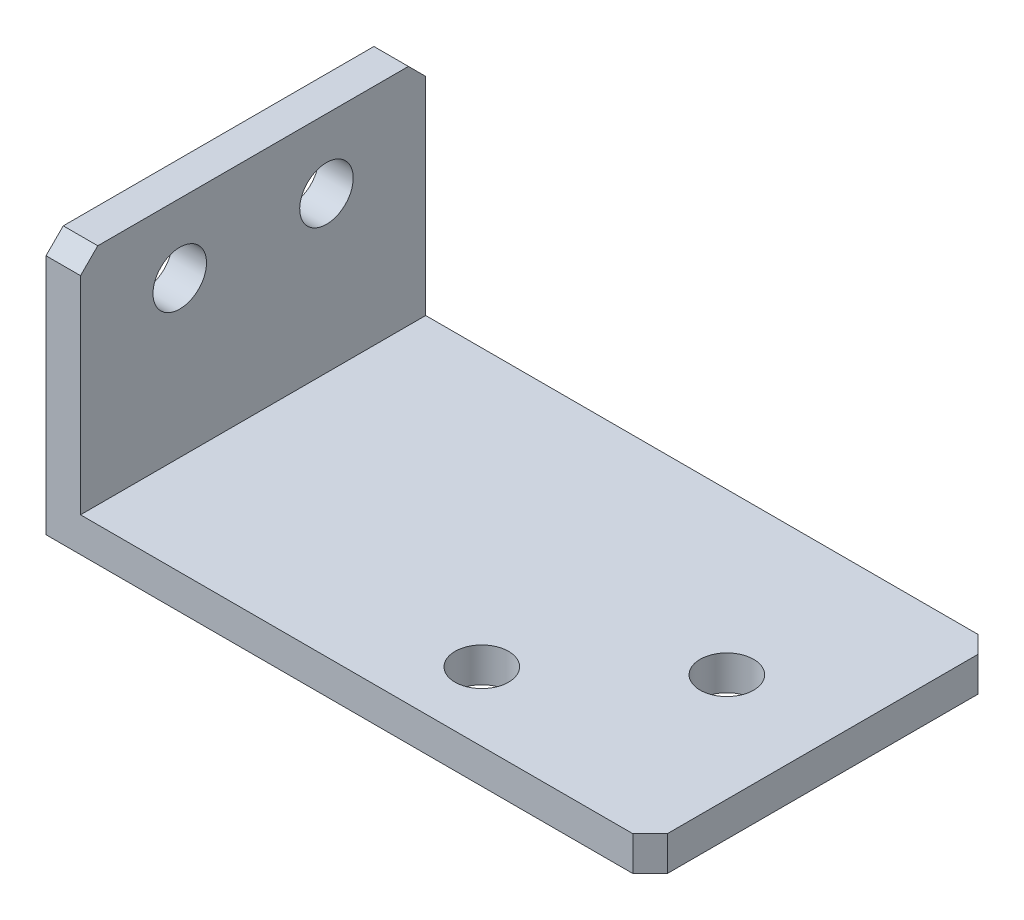
ISO-10303-21;
HEADER;
FILE_DESCRIPTION(('STEP AP214'),'2;1');
FILE_NAME('part.step','',(''),(''),'','','');
FILE_SCHEMA(('AUTOMOTIVE_DESIGN { 1 0 10303 214 1 1 1 1 }'));
ENDSEC;
DATA;
#1=APPLICATION_CONTEXT('core data for automotive mechanical design processes');
#2=APPLICATION_PROTOCOL_DEFINITION('international standard','automotive_design',2000,#1);
#3=PRODUCT_CONTEXT('',#1,'mechanical');
#4=PRODUCT('Part','Part','',(#3));
#5=PRODUCT_RELATED_PRODUCT_CATEGORY('part','',(#4));
#6=PRODUCT_DEFINITION_FORMATION('','',#4);
#7=PRODUCT_DEFINITION_CONTEXT('part definition',#1,'design');
#8=PRODUCT_DEFINITION('design','',#6,#7);
#9=PRODUCT_DEFINITION_SHAPE('','',#8);
#10=(LENGTH_UNIT() NAMED_UNIT(*) SI_UNIT(.MILLI.,.METRE.));
#11=(NAMED_UNIT(*) PLANE_ANGLE_UNIT() SI_UNIT($,.RADIAN.));
#12=(NAMED_UNIT(*) SI_UNIT($,.STERADIAN.) SOLID_ANGLE_UNIT());
#13=UNCERTAINTY_MEASURE_WITH_UNIT(LENGTH_MEASURE(1.E-05),#10,'distance_accuracy_value','');
#14=(GEOMETRIC_REPRESENTATION_CONTEXT(3) GLOBAL_UNCERTAINTY_ASSIGNED_CONTEXT((#13)) GLOBAL_UNIT_ASSIGNED_CONTEXT((#10,
#11,#12)) REPRESENTATION_CONTEXT('',''));
#15=CARTESIAN_POINT('',(0.,0.,0.));
#16=DIRECTION('',(0.,0.,1.));
#17=DIRECTION('',(1.,0.,0.));
#18=AXIS2_PLACEMENT_3D('',#15,#16,#17);
#19=CARTESIAN_POINT('',(0.,15.,20.));
#20=DIRECTION('',(1.,0.,0.));
#21=DIRECTION('',(0.,1.,0.));
#22=AXIS2_PLACEMENT_3D('',#19,#20,#21);
#23=PLANE('',#22);
#24=CARTESIAN_POINT('',(0.,11.,5.75));
#25=DIRECTION('',(-1.,0.,0.));
#26=DIRECTION('',(0.,-1.,0.));
#27=AXIS2_PLACEMENT_3D('',#24,#25,#26);
#28=CIRCLE('',#27,1.55);
#29=CARTESIAN_POINT('',(0.,9.45,5.75));
#30=VERTEX_POINT('',#29);
#31=EDGE_CURVE('E347',#30,#30,#28,.T.);
#32=ORIENTED_EDGE('',*,*,#31,.F.);
#33=EDGE_LOOP('',(#32));
#34=FACE_BOUND('',#33,.T.);
#35=CARTESIAN_POINT('',(0.,11.,14.25));
#36=DIRECTION('',(-1.,0.,0.));
#37=DIRECTION('',(0.,-1.,0.));
#38=AXIS2_PLACEMENT_3D('',#35,#36,#37);
#39=CIRCLE('',#38,1.55);
#40=CARTESIAN_POINT('',(0.,9.45,14.25));
#41=VERTEX_POINT('',#40);
#42=EDGE_CURVE('E350',#41,#41,#39,.T.);
#43=ORIENTED_EDGE('',*,*,#42,.F.);
#44=EDGE_LOOP('',(#43));
#45=FACE_BOUND('',#44,.T.);
#46=DIRECTION('',(0.,0.,-1.));
#47=VECTOR('',#46,1.);
#48=CARTESIAN_POINT('',(0.,15.,20.));
#49=LINE('',#48,#47);
#50=CARTESIAN_POINT('',(0.,15.,19.));
#51=VERTEX_POINT('',#50);
#52=CARTESIAN_POINT('',(0.,15.,1.00000000000001));
#53=VERTEX_POINT('',#52);
#54=EDGE_CURVE('E181',#51,#53,#49,.T.);
#55=ORIENTED_EDGE('',*,*,#54,.T.);
#56=DIRECTION('',(0.,0.707106781186548,0.707106781186548));
#57=VECTOR('',#56,1.);
#58=CARTESIAN_POINT('',(0.,15.,1.00000000000001));
#59=LINE('',#58,#57);
#60=CARTESIAN_POINT('',(0.,14.,0.));
#61=VERTEX_POINT('',#60);
#62=EDGE_CURVE('E166',#53,#61,#59,.F.);
#63=ORIENTED_EDGE('',*,*,#62,.T.);
#64=DIRECTION('',(0.,-1.,0.));
#65=VECTOR('',#64,1.);
#66=CARTESIAN_POINT('',(0.,15.,0.));
#67=LINE('',#66,#65);
#68=CARTESIAN_POINT('',(0.,0.,0.));
#69=VERTEX_POINT('',#68);
#70=EDGE_CURVE('E135',#61,#69,#67,.T.);
#71=ORIENTED_EDGE('',*,*,#70,.T.);
#72=DIRECTION('',(0.,0.,-1.));
#73=VECTOR('',#72,1.);
#74=CARTESIAN_POINT('',(0.,0.,20.));
#75=LINE('',#74,#73);
#76=CARTESIAN_POINT('',(0.,0.,20.));
#77=VERTEX_POINT('',#76);
#78=EDGE_CURVE('E127',#77,#69,#75,.T.);
#79=ORIENTED_EDGE('',*,*,#78,.F.);
#80=DIRECTION('',(0.,-1.,0.));
#81=VECTOR('',#80,1.);
#82=CARTESIAN_POINT('',(0.,15.,20.));
#83=LINE('',#82,#81);
#84=CARTESIAN_POINT('',(0.,14.,20.));
#85=VERTEX_POINT('',#84);
#86=EDGE_CURVE('E113',#85,#77,#83,.T.);
#87=ORIENTED_EDGE('',*,*,#86,.F.);
#88=DIRECTION('',(0.,0.707106781186548,-0.707106781186548));
#89=VECTOR('',#88,1.);
#90=CARTESIAN_POINT('',(0.,14.,20.));
#91=LINE('',#90,#89);
#92=EDGE_CURVE('E57',#85,#51,#91,.T.);
#93=ORIENTED_EDGE('',*,*,#92,.T.);
#94=EDGE_LOOP('',(#55,#63,#71,#79,#87,#93));
#95=FACE_BOUND('',#94,.T.);
#96=ADVANCED_FACE('F34',(#34,#45,#95),#23,.F.);
#97=CARTESIAN_POINT('',(0.,0.,20.));
#98=DIRECTION('',(0.,1.,0.));
#99=DIRECTION('',(0.,0.,1.));
#100=AXIS2_PLACEMENT_3D('',#97,#98,#99);
#101=PLANE('',#100);
#102=CARTESIAN_POINT('',(28.75,0.,9.29999999982406));
#103=DIRECTION('',(0.,1.,0.));
#104=DIRECTION('',(-1.,0.,0.));
#105=AXIS2_PLACEMENT_3D('',#102,#103,#104);
#106=CIRCLE('',#105,1.55);
#107=CARTESIAN_POINT('',(27.2,0.,9.29999999982406));
#108=VERTEX_POINT('',#107);
#109=EDGE_CURVE('E365',#108,#108,#106,.T.);
#110=ORIENTED_EDGE('',*,*,#109,.T.);
#111=EDGE_LOOP('',(#110));
#112=FACE_BOUND('',#111,.T.);
#113=CARTESIAN_POINT('',(21.25,0.,16.));
#114=DIRECTION('',(0.,1.,0.));
#115=DIRECTION('',(-1.,0.,0.));
#116=AXIS2_PLACEMENT_3D('',#113,#114,#115);
#117=CIRCLE('',#116,1.55);
#118=CARTESIAN_POINT('',(19.7,0.,16.));
#119=VERTEX_POINT('',#118);
#120=EDGE_CURVE('E348',#119,#119,#117,.T.);
#121=ORIENTED_EDGE('',*,*,#120,.T.);
#122=EDGE_LOOP('',(#121));
#123=FACE_BOUND('',#122,.T.);
#124=DIRECTION('',(1.,0.,0.));
#125=VECTOR('',#124,1.);
#126=CARTESIAN_POINT('',(0.,0.,0.));
#127=LINE('',#126,#125);
#128=CARTESIAN_POINT('',(34.,0.,0.));
#129=VERTEX_POINT('',#128);
#130=EDGE_CURVE('E185',#69,#129,#127,.T.);
#131=ORIENTED_EDGE('',*,*,#130,.T.);
#132=DIRECTION('',(-0.707106781186548,0.,-0.707106781186548));
#133=VECTOR('',#132,1.);
#134=CARTESIAN_POINT('',(35.,0.,1.00000000000001));
#135=LINE('',#134,#133);
#136=CARTESIAN_POINT('',(35.,0.,1.00000000000001));
#137=VERTEX_POINT('',#136);
#138=EDGE_CURVE('E158',#129,#137,#135,.F.);
#139=ORIENTED_EDGE('',*,*,#138,.T.);
#140=DIRECTION('',(0.,0.,-1.));
#141=VECTOR('',#140,1.);
#142=CARTESIAN_POINT('',(35.,0.,20.));
#143=LINE('',#142,#141);
#144=CARTESIAN_POINT('',(35.,0.,19.));
#145=VERTEX_POINT('',#144);
#146=EDGE_CURVE('E138',#145,#137,#143,.T.);
#147=ORIENTED_EDGE('',*,*,#146,.F.);
#148=DIRECTION('',(-0.707106781186544,0.,0.707106781186551));
#149=VECTOR('',#148,1.);
#150=CARTESIAN_POINT('',(34.,0.,20.));
#151=LINE('',#150,#149);
#152=CARTESIAN_POINT('',(34.,0.,20.));
#153=VERTEX_POINT('',#152);
#154=EDGE_CURVE('E130',#145,#153,#151,.T.);
#155=ORIENTED_EDGE('',*,*,#154,.T.);
#156=DIRECTION('',(1.,0.,0.));
#157=VECTOR('',#156,1.);
#158=CARTESIAN_POINT('',(0.,0.,20.));
#159=LINE('',#158,#157);
#160=EDGE_CURVE('E117',#77,#153,#159,.T.);
#161=ORIENTED_EDGE('',*,*,#160,.F.);
#162=ORIENTED_EDGE('',*,*,#78,.T.);
#163=EDGE_LOOP('',(#131,#139,#147,#155,#161,#162));
#164=FACE_BOUND('',#163,.T.);
#165=ADVANCED_FACE('F126',(#112,#123,#164),#101,.F.);
#166=CARTESIAN_POINT('',(35.,0.,20.));
#167=DIRECTION('',(-1.,0.,0.));
#168=DIRECTION('',(0.,0.,1.));
#169=AXIS2_PLACEMENT_3D('',#166,#167,#168);
#170=PLANE('',#169);
#171=ORIENTED_EDGE('',*,*,#146,.T.);
#172=DIRECTION('',(0.,1.,0.));
#173=VECTOR('',#172,1.);
#174=CARTESIAN_POINT('',(35.,0.,1.00000000000001));
#175=LINE('',#174,#173);
#176=CARTESIAN_POINT('',(35.,2.,1.00000000000001));
#177=VERTEX_POINT('',#176);
#178=EDGE_CURVE('E140',#137,#177,#175,.T.);
#179=ORIENTED_EDGE('',*,*,#178,.T.);
#180=DIRECTION('',(0.,0.,-1.));
#181=VECTOR('',#180,1.);
#182=CARTESIAN_POINT('',(35.,2.,20.));
#183=LINE('',#182,#181);
#184=CARTESIAN_POINT('',(35.,2.,19.));
#185=VERTEX_POINT('',#184);
#186=EDGE_CURVE('E143',#185,#177,#183,.T.);
#187=ORIENTED_EDGE('',*,*,#186,.F.);
#188=DIRECTION('',(0.,-1.,0.));
#189=VECTOR('',#188,1.);
#190=CARTESIAN_POINT('',(35.,0.,19.));
#191=LINE('',#190,#189);
#192=EDGE_CURVE('E137',#185,#145,#191,.T.);
#193=ORIENTED_EDGE('',*,*,#192,.T.);
#194=EDGE_LOOP('',(#171,#179,#187,#193));
#195=FACE_BOUND('',#194,.T.);
#196=ADVANCED_FACE('F199',(#195),#170,.F.);
#197=CARTESIAN_POINT('',(35.,2.,20.));
#198=DIRECTION('',(0.,-1.,0.));
#199=DIRECTION('',(1.,0.,0.));
#200=AXIS2_PLACEMENT_3D('',#197,#198,#199);
#201=PLANE('',#200);
#202=CARTESIAN_POINT('',(28.75,2.,9.29999999982406));
#203=DIRECTION('',(0.,1.,0.));
#204=DIRECTION('',(-1.,0.,0.));
#205=AXIS2_PLACEMENT_3D('',#202,#203,#204);
#206=CIRCLE('',#205,1.55);
#207=CARTESIAN_POINT('',(27.2,2.,9.29999999982406));
#208=VERTEX_POINT('',#207);
#209=EDGE_CURVE('E367',#208,#208,#206,.T.);
#210=ORIENTED_EDGE('',*,*,#209,.F.);
#211=EDGE_LOOP('',(#210));
#212=FACE_BOUND('',#211,.T.);
#213=CARTESIAN_POINT('',(21.25,2.,16.));
#214=DIRECTION('',(0.,1.,0.));
#215=DIRECTION('',(-1.,0.,0.));
#216=AXIS2_PLACEMENT_3D('',#213,#214,#215);
#217=CIRCLE('',#216,1.55);
#218=CARTESIAN_POINT('',(19.7,2.,16.));
#219=VERTEX_POINT('',#218);
#220=EDGE_CURVE('E353',#219,#219,#217,.T.);
#221=ORIENTED_EDGE('',*,*,#220,.F.);
#222=EDGE_LOOP('',(#221));
#223=FACE_BOUND('',#222,.T.);
#224=ORIENTED_EDGE('',*,*,#186,.T.);
#225=DIRECTION('',(0.707106781186548,0.,0.707106781186548));
#226=VECTOR('',#225,1.);
#227=CARTESIAN_POINT('',(35.,2.,1.00000000000001));
#228=LINE('',#227,#226);
#229=CARTESIAN_POINT('',(34.,2.,0.));
#230=VERTEX_POINT('',#229);
#231=EDGE_CURVE('E151',#177,#230,#228,.F.);
#232=ORIENTED_EDGE('',*,*,#231,.T.);
#233=DIRECTION('',(-1.,0.,0.));
#234=VECTOR('',#233,1.);
#235=CARTESIAN_POINT('',(35.,2.,0.));
#236=LINE('',#235,#234);
#237=CARTESIAN_POINT('',(2.,2.,0.));
#238=VERTEX_POINT('',#237);
#239=EDGE_CURVE('E188',#230,#238,#236,.T.);
#240=ORIENTED_EDGE('',*,*,#239,.T.);
#241=DIRECTION('',(0.,0.,-1.));
#242=VECTOR('',#241,1.);
#243=CARTESIAN_POINT('',(2.,2.,20.));
#244=LINE('',#243,#242);
#245=CARTESIAN_POINT('',(2.,2.,20.));
#246=VERTEX_POINT('',#245);
#247=EDGE_CURVE('E178',#246,#238,#244,.T.);
#248=ORIENTED_EDGE('',*,*,#247,.F.);
#249=DIRECTION('',(-1.,0.,0.));
#250=VECTOR('',#249,1.);
#251=CARTESIAN_POINT('',(35.,2.,20.));
#252=LINE('',#251,#250);
#253=CARTESIAN_POINT('',(34.,2.,20.));
#254=VERTEX_POINT('',#253);
#255=EDGE_CURVE('E131',#254,#246,#252,.T.);
#256=ORIENTED_EDGE('',*,*,#255,.F.);
#257=DIRECTION('',(0.707106781186544,0.,-0.707106781186551));
#258=VECTOR('',#257,1.);
#259=CARTESIAN_POINT('',(34.,2.,20.));
#260=LINE('',#259,#258);
#261=EDGE_CURVE('E149',#254,#185,#260,.T.);
#262=ORIENTED_EDGE('',*,*,#261,.T.);
#263=EDGE_LOOP('',(#224,#232,#240,#248,#256,#262));
#264=FACE_BOUND('',#263,.T.);
#265=ADVANCED_FACE('F175',(#212,#223,#264),#201,.F.);
#266=CARTESIAN_POINT('',(2.,2.,20.));
#267=DIRECTION('',(-1.,0.,0.));
#268=DIRECTION('',(0.,-1.,0.));
#269=AXIS2_PLACEMENT_3D('',#266,#267,#268);
#270=PLANE('',#269);
#271=CARTESIAN_POINT('',(2.,11.,5.75));
#272=DIRECTION('',(-1.,0.,0.));
#273=DIRECTION('',(0.,-1.,0.));
#274=AXIS2_PLACEMENT_3D('',#271,#272,#273);
#275=CIRCLE('',#274,1.55);
#276=CARTESIAN_POINT('',(2.,9.45,5.75));
#277=VERTEX_POINT('',#276);
#278=EDGE_CURVE('E345',#277,#277,#275,.F.);
#279=ORIENTED_EDGE('',*,*,#278,.F.);
#280=EDGE_LOOP('',(#279));
#281=FACE_BOUND('',#280,.T.);
#282=CARTESIAN_POINT('',(2.,11.,14.25));
#283=DIRECTION('',(-1.,0.,0.));
#284=DIRECTION('',(0.,-1.,0.));
#285=AXIS2_PLACEMENT_3D('',#282,#283,#284);
#286=CIRCLE('',#285,1.55);
#287=CARTESIAN_POINT('',(2.,9.45,14.25));
#288=VERTEX_POINT('',#287);
#289=EDGE_CURVE('E186',#288,#288,#286,.F.);
#290=ORIENTED_EDGE('',*,*,#289,.F.);
#291=EDGE_LOOP('',(#290));
#292=FACE_BOUND('',#291,.T.);
#293=DIRECTION('',(0.,1.,0.));
#294=VECTOR('',#293,1.);
#295=CARTESIAN_POINT('',(2.,2.,0.));
#296=LINE('',#295,#294);
#297=CARTESIAN_POINT('',(2.,14.,0.));
#298=VERTEX_POINT('',#297);
#299=EDGE_CURVE('E121',#238,#298,#296,.T.);
#300=ORIENTED_EDGE('',*,*,#299,.T.);
#301=DIRECTION('',(0.,-0.707106781186548,-0.707106781186548));
#302=VECTOR('',#301,1.);
#303=CARTESIAN_POINT('',(2.,15.,1.00000000000001));
#304=LINE('',#303,#302);
#305=CARTESIAN_POINT('',(2.,15.,1.00000000000001));
#306=VERTEX_POINT('',#305);
#307=EDGE_CURVE('E169',#298,#306,#304,.F.);
#308=ORIENTED_EDGE('',*,*,#307,.T.);
#309=DIRECTION('',(0.,0.,-1.));
#310=VECTOR('',#309,1.);
#311=CARTESIAN_POINT('',(2.,15.,20.));
#312=LINE('',#311,#310);
#313=CARTESIAN_POINT('',(2.,15.,19.));
#314=VERTEX_POINT('',#313);
#315=EDGE_CURVE('E193',#314,#306,#312,.T.);
#316=ORIENTED_EDGE('',*,*,#315,.F.);
#317=DIRECTION('',(0.,-0.707106781186548,0.707106781186548));
#318=VECTOR('',#317,1.);
#319=CARTESIAN_POINT('',(2.,14.,20.));
#320=LINE('',#319,#318);
#321=CARTESIAN_POINT('',(2.,14.,20.));
#322=VERTEX_POINT('',#321);
#323=EDGE_CURVE('E49',#314,#322,#320,.T.);
#324=ORIENTED_EDGE('',*,*,#323,.T.);
#325=DIRECTION('',(0.,1.,0.));
#326=VECTOR('',#325,1.);
#327=CARTESIAN_POINT('',(2.,2.,20.));
#328=LINE('',#327,#326);
#329=EDGE_CURVE('E179',#246,#322,#328,.T.);
#330=ORIENTED_EDGE('',*,*,#329,.F.);
#331=ORIENTED_EDGE('',*,*,#247,.T.);
#332=EDGE_LOOP('',(#300,#308,#316,#324,#330,#331));
#333=FACE_BOUND('',#332,.T.);
#334=ADVANCED_FACE('F231',(#281,#292,#333),#270,.F.);
#335=CARTESIAN_POINT('',(2.,15.,20.));
#336=DIRECTION('',(0.,-1.,0.));
#337=DIRECTION('',(0.,0.,-1.));
#338=AXIS2_PLACEMENT_3D('',#335,#336,#337);
#339=PLANE('',#338);
#340=ORIENTED_EDGE('',*,*,#315,.T.);
#341=DIRECTION('',(-1.,0.,0.));
#342=VECTOR('',#341,1.);
#343=CARTESIAN_POINT('',(2.,15.,1.00000000000001));
#344=LINE('',#343,#342);
#345=EDGE_CURVE('E162',#306,#53,#344,.T.);
#346=ORIENTED_EDGE('',*,*,#345,.T.);
#347=ORIENTED_EDGE('',*,*,#54,.F.);
#348=DIRECTION('',(1.,0.,0.));
#349=VECTOR('',#348,1.);
#350=CARTESIAN_POINT('',(2.,15.,19.));
#351=LINE('',#350,#349);
#352=EDGE_CURVE('E160',#51,#314,#351,.T.);
#353=ORIENTED_EDGE('',*,*,#352,.T.);
#354=EDGE_LOOP('',(#340,#346,#347,#353));
#355=FACE_BOUND('',#354,.T.);
#356=ADVANCED_FACE('F234',(#355),#339,.F.);
#357=CARTESIAN_POINT('',(0.,0.,20.));
#358=DIRECTION('',(0.,0.,1.));
#359=DIRECTION('',(1.,0.,0.));
#360=AXIS2_PLACEMENT_3D('',#357,#358,#359);
#361=PLANE('',#360);
#362=ORIENTED_EDGE('',*,*,#329,.T.);
#363=DIRECTION('',(-1.,0.,0.));
#364=VECTOR('',#363,1.);
#365=CARTESIAN_POINT('',(0.,14.,20.));
#366=LINE('',#365,#364);
#367=EDGE_CURVE('E11',#322,#85,#366,.T.);
#368=ORIENTED_EDGE('',*,*,#367,.T.);
#369=ORIENTED_EDGE('',*,*,#86,.T.);
#370=ORIENTED_EDGE('',*,*,#160,.T.);
#371=DIRECTION('',(0.,1.,0.));
#372=VECTOR('',#371,1.);
#373=CARTESIAN_POINT('',(34.,2.,20.));
#374=LINE('',#373,#372);
#375=EDGE_CURVE('E42',#153,#254,#374,.T.);
#376=ORIENTED_EDGE('',*,*,#375,.T.);
#377=ORIENTED_EDGE('',*,*,#255,.T.);
#378=EDGE_LOOP('',(#362,#368,#369,#370,#376,#377));
#379=FACE_BOUND('',#378,.T.);
#380=ADVANCED_FACE('F115',(#379),#361,.T.);
#381=CARTESIAN_POINT('',(0.,0.,0.));
#382=DIRECTION('',(0.,0.,1.));
#383=DIRECTION('',(1.,0.,0.));
#384=AXIS2_PLACEMENT_3D('',#381,#382,#383);
#385=PLANE('',#384);
#386=ORIENTED_EDGE('',*,*,#239,.F.);
#387=DIRECTION('',(0.,-1.,0.));
#388=VECTOR('',#387,1.);
#389=CARTESIAN_POINT('',(34.,0.,0.));
#390=LINE('',#389,#388);
#391=EDGE_CURVE('E155',#230,#129,#390,.T.);
#392=ORIENTED_EDGE('',*,*,#391,.T.);
#393=ORIENTED_EDGE('',*,*,#130,.F.);
#394=ORIENTED_EDGE('',*,*,#70,.F.);
#395=DIRECTION('',(1.,0.,0.));
#396=VECTOR('',#395,1.);
#397=CARTESIAN_POINT('',(0.,14.,0.));
#398=LINE('',#397,#396);
#399=EDGE_CURVE('E153',#61,#298,#398,.T.);
#400=ORIENTED_EDGE('',*,*,#399,.T.);
#401=ORIENTED_EDGE('',*,*,#299,.F.);
#402=EDGE_LOOP('',(#386,#392,#393,#394,#400,#401));
#403=FACE_BOUND('',#402,.T.);
#404=ADVANCED_FACE('F237',(#403),#385,.F.);
#405=CARTESIAN_POINT('',(6.3840620433566,11.,14.25));
#406=DIRECTION('',(-1.,0.,0.));
#407=DIRECTION('',(0.,-1.,0.));
#408=AXIS2_PLACEMENT_3D('',#405,#406,#407);
#409=CYLINDRICAL_SURFACE('',#408,1.55);
#410=ORIENTED_EDGE('',*,*,#289,.T.);
#411=EDGE_LOOP('',(#410));
#412=FACE_BOUND('',#411,.T.);
#413=ORIENTED_EDGE('',*,*,#42,.T.);
#414=EDGE_LOOP('',(#413));
#415=FACE_BOUND('',#414,.T.);
#416=ADVANCED_FACE('F241',(#412,#415),#409,.F.);
#417=CARTESIAN_POINT('',(6.3840620433566,11.,5.75));
#418=DIRECTION('',(-1.,0.,0.));
#419=DIRECTION('',(0.,-1.,0.));
#420=AXIS2_PLACEMENT_3D('',#417,#418,#419);
#421=CYLINDRICAL_SURFACE('',#420,1.55);
#422=ORIENTED_EDGE('',*,*,#278,.T.);
#423=EDGE_LOOP('',(#422));
#424=FACE_BOUND('',#423,.T.);
#425=ORIENTED_EDGE('',*,*,#31,.T.);
#426=EDGE_LOOP('',(#425));
#427=FACE_BOUND('',#426,.T.);
#428=ADVANCED_FACE('F247',(#424,#427),#421,.F.);
#429=CARTESIAN_POINT('',(21.25,0.,16.));
#430=DIRECTION('',(0.,1.,0.));
#431=DIRECTION('',(-1.,0.,0.));
#432=AXIS2_PLACEMENT_3D('',#429,#430,#431);
#433=CYLINDRICAL_SURFACE('',#432,1.55);
#434=ORIENTED_EDGE('',*,*,#120,.F.);
#435=EDGE_LOOP('',(#434));
#436=FACE_BOUND('',#435,.T.);
#437=ORIENTED_EDGE('',*,*,#220,.T.);
#438=EDGE_LOOP('',(#437));
#439=FACE_BOUND('',#438,.T.);
#440=ADVANCED_FACE('F314',(#436,#439),#433,.F.);
#441=CARTESIAN_POINT('',(28.75,0.,9.29999999982406));
#442=DIRECTION('',(0.,1.,0.));
#443=DIRECTION('',(-1.,0.,0.));
#444=AXIS2_PLACEMENT_3D('',#441,#442,#443);
#445=CYLINDRICAL_SURFACE('',#444,1.55);
#446=ORIENTED_EDGE('',*,*,#109,.F.);
#447=EDGE_LOOP('',(#446));
#448=FACE_BOUND('',#447,.T.);
#449=ORIENTED_EDGE('',*,*,#209,.T.);
#450=EDGE_LOOP('',(#449));
#451=FACE_BOUND('',#450,.T.);
#452=ADVANCED_FACE('F222',(#448,#451),#445,.F.);
#453=CARTESIAN_POINT('',(35.,0.,1.00000000000001));
#454=DIRECTION('',(-0.707106781186547,0.,0.707106781186547));
#455=DIRECTION('',(0.,1.,0.));
#456=AXIS2_PLACEMENT_3D('',#453,#454,#455);
#457=PLANE('',#456);
#458=ORIENTED_EDGE('',*,*,#138,.F.);
#459=ORIENTED_EDGE('',*,*,#391,.F.);
#460=ORIENTED_EDGE('',*,*,#231,.F.);
#461=ORIENTED_EDGE('',*,*,#178,.F.);
#462=EDGE_LOOP('',(#458,#459,#460,#461));
#463=FACE_BOUND('',#462,.T.);
#464=ADVANCED_FACE('F219',(#463),#457,.F.);
#465=CARTESIAN_POINT('',(2.,15.,1.00000000000001));
#466=DIRECTION('',(0.,-0.707106781186547,0.707106781186547));
#467=DIRECTION('',(-1.,0.,0.));
#468=AXIS2_PLACEMENT_3D('',#465,#466,#467);
#469=PLANE('',#468);
#470=ORIENTED_EDGE('',*,*,#307,.F.);
#471=ORIENTED_EDGE('',*,*,#399,.F.);
#472=ORIENTED_EDGE('',*,*,#62,.F.);
#473=ORIENTED_EDGE('',*,*,#345,.F.);
#474=EDGE_LOOP('',(#470,#471,#472,#473));
#475=FACE_BOUND('',#474,.T.);
#476=ADVANCED_FACE('F206',(#475),#469,.F.);
#477=CARTESIAN_POINT('',(0.,14.,20.));
#478=DIRECTION('',(0.,0.707106781186547,0.707106781186547));
#479=DIRECTION('',(1.,0.,0.));
#480=AXIS2_PLACEMENT_3D('',#477,#478,#479);
#481=PLANE('',#480);
#482=ORIENTED_EDGE('',*,*,#323,.F.);
#483=ORIENTED_EDGE('',*,*,#352,.F.);
#484=ORIENTED_EDGE('',*,*,#92,.F.);
#485=ORIENTED_EDGE('',*,*,#367,.F.);
#486=EDGE_LOOP('',(#482,#483,#484,#485));
#487=FACE_BOUND('',#486,.T.);
#488=ADVANCED_FACE('F202',(#487),#481,.T.);
#489=CARTESIAN_POINT('',(34.,0.,20.));
#490=DIRECTION('',(0.707106781186551,0.,0.707106781186544));
#491=DIRECTION('',(0.,-1.,0.));
#492=AXIS2_PLACEMENT_3D('',#489,#490,#491);
#493=PLANE('',#492);
#494=ORIENTED_EDGE('',*,*,#154,.F.);
#495=ORIENTED_EDGE('',*,*,#192,.F.);
#496=ORIENTED_EDGE('',*,*,#261,.F.);
#497=ORIENTED_EDGE('',*,*,#375,.F.);
#498=EDGE_LOOP('',(#494,#495,#496,#497));
#499=FACE_BOUND('',#498,.T.);
#500=ADVANCED_FACE('F36',(#499),#493,.T.);
#501=CLOSED_SHELL('',(#96,#165,#196,#265,#334,#356,#380,#404,#416,#428,#440,#452,#464,#476,#488,#500));
#502=MANIFOLD_SOLID_BREP('B2',#501);
#503=ADVANCED_BREP_SHAPE_REPRESENTATION('',(#18,#502),#14);
#504=SHAPE_DEFINITION_REPRESENTATION(#9,#503);
ENDSEC;
END-ISO-10303-21;
